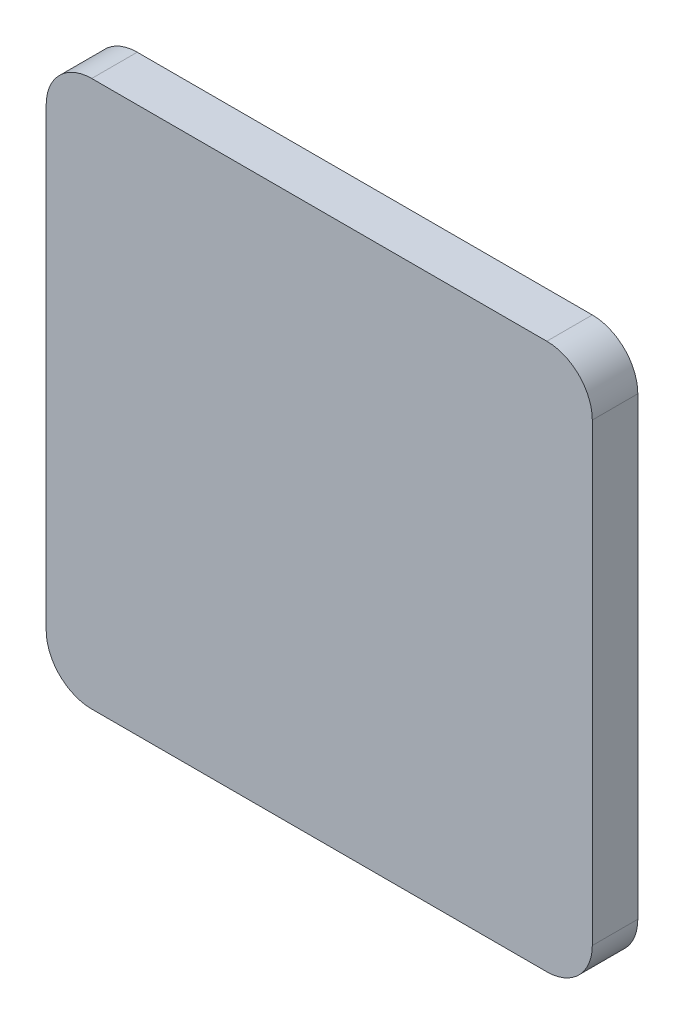
ISO-10303-21;
HEADER;
FILE_DESCRIPTION(('STEP AP214'),'2;1');
FILE_NAME('part.step','',(''),(''),'','','');
FILE_SCHEMA(('AUTOMOTIVE_DESIGN { 1 0 10303 214 1 1 1 1 }'));
ENDSEC;
DATA;
#1=APPLICATION_CONTEXT('core data for automotive mechanical design processes');
#2=APPLICATION_PROTOCOL_DEFINITION('international standard','automotive_design',2000,#1);
#3=PRODUCT_CONTEXT('',#1,'mechanical');
#4=PRODUCT('Part','Part','',(#3));
#5=PRODUCT_RELATED_PRODUCT_CATEGORY('part','',(#4));
#6=PRODUCT_DEFINITION_FORMATION('','',#4);
#7=PRODUCT_DEFINITION_CONTEXT('part definition',#1,'design');
#8=PRODUCT_DEFINITION('design','',#6,#7);
#9=PRODUCT_DEFINITION_SHAPE('','',#8);
#10=(LENGTH_UNIT() NAMED_UNIT(*) SI_UNIT(.MILLI.,.METRE.));
#11=(NAMED_UNIT(*) PLANE_ANGLE_UNIT() SI_UNIT($,.RADIAN.));
#12=(NAMED_UNIT(*) SI_UNIT($,.STERADIAN.) SOLID_ANGLE_UNIT());
#13=UNCERTAINTY_MEASURE_WITH_UNIT(LENGTH_MEASURE(1.E-05),#10,'distance_accuracy_value','');
#14=(GEOMETRIC_REPRESENTATION_CONTEXT(3) GLOBAL_UNCERTAINTY_ASSIGNED_CONTEXT((#13)) GLOBAL_UNIT_ASSIGNED_CONTEXT((#10,
#11,#12)) REPRESENTATION_CONTEXT('',''));
#15=CARTESIAN_POINT('',(0.,0.,0.));
#16=DIRECTION('',(0.,0.,1.));
#17=DIRECTION('',(1.,0.,0.));
#18=AXIS2_PLACEMENT_3D('',#15,#16,#17);
#19=CARTESIAN_POINT('',(-49.9999999999999,60.,10.));
#20=DIRECTION('',(0.,1.,0.));
#21=DIRECTION('',(0.,0.,1.));
#22=AXIS2_PLACEMENT_3D('',#19,#20,#21);
#23=PLANE('',#22);
#24=DIRECTION('',(1.,0.,0.));
#25=VECTOR('',#24,1.);
#26=CARTESIAN_POINT('',(-49.9999999999999,60.,0.));
#27=LINE('',#26,#25);
#28=CARTESIAN_POINT('',(-49.9999999999999,60.,0.));
#29=VERTEX_POINT('',#28);
#30=CARTESIAN_POINT('',(49.9999999999999,60.,0.));
#31=VERTEX_POINT('',#30);
#32=EDGE_CURVE('E130',#29,#31,#27,.T.);
#33=ORIENTED_EDGE('',*,*,#32,.F.);
#34=DIRECTION('',(0.,0.,-1.));
#35=VECTOR('',#34,1.);
#36=CARTESIAN_POINT('',(-49.9999999999999,60.,10.));
#37=LINE('',#36,#35);
#38=CARTESIAN_POINT('',(-49.9999999999999,60.,10.));
#39=VERTEX_POINT('',#38);
#40=EDGE_CURVE('E11',#39,#29,#37,.T.);
#41=ORIENTED_EDGE('',*,*,#40,.F.);
#42=DIRECTION('',(1.,0.,0.));
#43=VECTOR('',#42,1.);
#44=CARTESIAN_POINT('',(-49.9999999999999,60.,10.));
#45=LINE('',#44,#43);
#46=CARTESIAN_POINT('',(49.9999999999999,60.,10.));
#47=VERTEX_POINT('',#46);
#48=EDGE_CURVE('E147',#39,#47,#45,.T.);
#49=ORIENTED_EDGE('',*,*,#48,.T.);
#50=DIRECTION('',(0.,0.,-1.));
#51=VECTOR('',#50,1.);
#52=CARTESIAN_POINT('',(49.9999999999999,60.,10.));
#53=LINE('',#52,#51);
#54=EDGE_CURVE('E35',#47,#31,#53,.T.);
#55=ORIENTED_EDGE('',*,*,#54,.T.);
#56=EDGE_LOOP('',(#33,#41,#49,#55));
#57=FACE_BOUND('',#56,.T.);
#58=ADVANCED_FACE('F32',(#57),#23,.T.);
#59=CARTESIAN_POINT('',(-50.,50.,10.));
#60=DIRECTION('',(0.,0.,-1.));
#61=DIRECTION('',(-1.,0.,0.));
#62=AXIS2_PLACEMENT_3D('',#59,#60,#61);
#63=CYLINDRICAL_SURFACE('',#62,10.);
#64=CARTESIAN_POINT('',(-50.,50.,0.));
#65=DIRECTION('',(0.,0.,1.));
#66=DIRECTION('',(1.,0.,0.));
#67=AXIS2_PLACEMENT_3D('',#64,#65,#66);
#68=CIRCLE('',#67,10.);
#69=CARTESIAN_POINT('',(-60.,49.9999999999999,0.));
#70=VERTEX_POINT('',#69);
#71=EDGE_CURVE('E77',#29,#70,#68,.T.);
#72=ORIENTED_EDGE('',*,*,#71,.T.);
#73=DIRECTION('',(0.,0.,-1.));
#74=VECTOR('',#73,1.);
#75=CARTESIAN_POINT('',(-60.,49.9999999999999,10.));
#76=LINE('',#75,#74);
#77=CARTESIAN_POINT('',(-60.,49.9999999999999,10.));
#78=VERTEX_POINT('',#77);
#79=EDGE_CURVE('E41',#78,#70,#76,.T.);
#80=ORIENTED_EDGE('',*,*,#79,.F.);
#81=CARTESIAN_POINT('',(-50.,50.,10.));
#82=DIRECTION('',(0.,0.,1.));
#83=DIRECTION('',(1.,0.,0.));
#84=AXIS2_PLACEMENT_3D('',#81,#82,#83);
#85=CIRCLE('',#84,10.);
#86=EDGE_CURVE('E108',#39,#78,#85,.T.);
#87=ORIENTED_EDGE('',*,*,#86,.F.);
#88=ORIENTED_EDGE('',*,*,#40,.T.);
#89=EDGE_LOOP('',(#72,#80,#87,#88));
#90=FACE_BOUND('',#89,.T.);
#91=ADVANCED_FACE('F186',(#90),#63,.T.);
#92=CARTESIAN_POINT('',(-60.,49.9999999999999,10.));
#93=DIRECTION('',(1.,0.,0.));
#94=DIRECTION('',(0.,1.,0.));
#95=AXIS2_PLACEMENT_3D('',#92,#93,#94);
#96=PLANE('',#95);
#97=DIRECTION('',(0.,-1.,0.));
#98=VECTOR('',#97,1.);
#99=CARTESIAN_POINT('',(-60.,49.9999999999999,0.));
#100=LINE('',#99,#98);
#101=CARTESIAN_POINT('',(-60.,-49.9999999999999,0.));
#102=VERTEX_POINT('',#101);
#103=EDGE_CURVE('E115',#70,#102,#100,.T.);
#104=ORIENTED_EDGE('',*,*,#103,.T.);
#105=DIRECTION('',(0.,0.,-1.));
#106=VECTOR('',#105,1.);
#107=CARTESIAN_POINT('',(-60.,-49.9999999999999,10.));
#108=LINE('',#107,#106);
#109=CARTESIAN_POINT('',(-60.,-49.9999999999999,10.));
#110=VERTEX_POINT('',#109);
#111=EDGE_CURVE('E112',#110,#102,#108,.T.);
#112=ORIENTED_EDGE('',*,*,#111,.F.);
#113=DIRECTION('',(0.,-1.,0.));
#114=VECTOR('',#113,1.);
#115=CARTESIAN_POINT('',(-60.,49.9999999999999,10.));
#116=LINE('',#115,#114);
#117=EDGE_CURVE('E101',#78,#110,#116,.T.);
#118=ORIENTED_EDGE('',*,*,#117,.F.);
#119=ORIENTED_EDGE('',*,*,#79,.T.);
#120=EDGE_LOOP('',(#104,#112,#118,#119));
#121=FACE_BOUND('',#120,.T.);
#122=ADVANCED_FACE('F113',(#121),#96,.F.);
#123=CARTESIAN_POINT('',(-50.,-50.,10.));
#124=DIRECTION('',(0.,0.,-1.));
#125=DIRECTION('',(-1.,0.,0.));
#126=AXIS2_PLACEMENT_3D('',#123,#124,#125);
#127=CYLINDRICAL_SURFACE('',#126,10.);
#128=CARTESIAN_POINT('',(-50.,-50.,0.));
#129=DIRECTION('',(0.,0.,1.));
#130=DIRECTION('',(1.,0.,0.));
#131=AXIS2_PLACEMENT_3D('',#128,#129,#130);
#132=CIRCLE('',#131,10.);
#133=CARTESIAN_POINT('',(-49.9999999999999,-60.,0.));
#134=VERTEX_POINT('',#133);
#135=EDGE_CURVE('E144',#102,#134,#132,.T.);
#136=ORIENTED_EDGE('',*,*,#135,.T.);
#137=DIRECTION('',(0.,0.,-1.));
#138=VECTOR('',#137,1.);
#139=CARTESIAN_POINT('',(-49.9999999999999,-60.,10.));
#140=LINE('',#139,#138);
#141=CARTESIAN_POINT('',(-49.9999999999999,-60.,10.));
#142=VERTEX_POINT('',#141);
#143=EDGE_CURVE('E118',#142,#134,#140,.T.);
#144=ORIENTED_EDGE('',*,*,#143,.F.);
#145=CARTESIAN_POINT('',(-50.,-50.,10.));
#146=DIRECTION('',(0.,0.,1.));
#147=DIRECTION('',(1.,0.,0.));
#148=AXIS2_PLACEMENT_3D('',#145,#146,#147);
#149=CIRCLE('',#148,10.);
#150=EDGE_CURVE('E106',#110,#142,#149,.T.);
#151=ORIENTED_EDGE('',*,*,#150,.F.);
#152=ORIENTED_EDGE('',*,*,#111,.T.);
#153=EDGE_LOOP('',(#136,#144,#151,#152));
#154=FACE_BOUND('',#153,.T.);
#155=ADVANCED_FACE('F120',(#154),#127,.T.);
#156=CARTESIAN_POINT('',(-49.9999999999999,-60.,10.));
#157=DIRECTION('',(0.,1.,0.));
#158=DIRECTION('',(0.,0.,1.));
#159=AXIS2_PLACEMENT_3D('',#156,#157,#158);
#160=PLANE('',#159);
#161=DIRECTION('',(1.,0.,0.));
#162=VECTOR('',#161,1.);
#163=CARTESIAN_POINT('',(-49.9999999999999,-60.,0.));
#164=LINE('',#163,#162);
#165=CARTESIAN_POINT('',(49.9999999999999,-60.,0.));
#166=VERTEX_POINT('',#165);
#167=EDGE_CURVE('E142',#134,#166,#164,.T.);
#168=ORIENTED_EDGE('',*,*,#167,.T.);
#169=DIRECTION('',(0.,0.,-1.));
#170=VECTOR('',#169,1.);
#171=CARTESIAN_POINT('',(49.9999999999999,-60.,10.));
#172=LINE('',#171,#170);
#173=CARTESIAN_POINT('',(49.9999999999999,-60.,10.));
#174=VERTEX_POINT('',#173);
#175=EDGE_CURVE('E151',#174,#166,#172,.T.);
#176=ORIENTED_EDGE('',*,*,#175,.F.);
#177=DIRECTION('',(1.,0.,0.));
#178=VECTOR('',#177,1.);
#179=CARTESIAN_POINT('',(-49.9999999999999,-60.,10.));
#180=LINE('',#179,#178);
#181=EDGE_CURVE('E123',#142,#174,#180,.T.);
#182=ORIENTED_EDGE('',*,*,#181,.F.);
#183=ORIENTED_EDGE('',*,*,#143,.T.);
#184=EDGE_LOOP('',(#168,#176,#182,#183));
#185=FACE_BOUND('',#184,.T.);
#186=ADVANCED_FACE('F163',(#185),#160,.F.);
#187=CARTESIAN_POINT('',(50.,-50.,10.));
#188=DIRECTION('',(0.,0.,-1.));
#189=DIRECTION('',(-1.,0.,0.));
#190=AXIS2_PLACEMENT_3D('',#187,#188,#189);
#191=CYLINDRICAL_SURFACE('',#190,10.);
#192=CARTESIAN_POINT('',(50.,-50.,0.));
#193=DIRECTION('',(0.,0.,1.));
#194=DIRECTION('',(1.,0.,0.));
#195=AXIS2_PLACEMENT_3D('',#192,#193,#194);
#196=CIRCLE('',#195,10.);
#197=CARTESIAN_POINT('',(60.,-50.,0.));
#198=VERTEX_POINT('',#197);
#199=EDGE_CURVE('E139',#166,#198,#196,.T.);
#200=ORIENTED_EDGE('',*,*,#199,.T.);
#201=DIRECTION('',(0.,0.,-1.));
#202=VECTOR('',#201,1.);
#203=CARTESIAN_POINT('',(60.,-50.,10.));
#204=LINE('',#203,#202);
#205=CARTESIAN_POINT('',(60.,-50.,10.));
#206=VERTEX_POINT('',#205);
#207=EDGE_CURVE('E154',#206,#198,#204,.T.);
#208=ORIENTED_EDGE('',*,*,#207,.F.);
#209=CARTESIAN_POINT('',(50.,-50.,10.));
#210=DIRECTION('',(0.,0.,1.));
#211=DIRECTION('',(1.,0.,0.));
#212=AXIS2_PLACEMENT_3D('',#209,#210,#211);
#213=CIRCLE('',#212,10.);
#214=EDGE_CURVE('E125',#174,#206,#213,.T.);
#215=ORIENTED_EDGE('',*,*,#214,.F.);
#216=ORIENTED_EDGE('',*,*,#175,.T.);
#217=EDGE_LOOP('',(#200,#208,#215,#216));
#218=FACE_BOUND('',#217,.T.);
#219=ADVANCED_FACE('F171',(#218),#191,.T.);
#220=CARTESIAN_POINT('',(60.,49.9999999999999,10.));
#221=DIRECTION('',(1.,0.,0.));
#222=DIRECTION('',(0.,1.,0.));
#223=AXIS2_PLACEMENT_3D('',#220,#221,#222);
#224=PLANE('',#223);
#225=DIRECTION('',(0.,-1.,0.));
#226=VECTOR('',#225,1.);
#227=CARTESIAN_POINT('',(60.,49.9999999999999,0.));
#228=LINE('',#227,#226);
#229=CARTESIAN_POINT('',(60.,49.9999999999999,0.));
#230=VERTEX_POINT('',#229);
#231=EDGE_CURVE('E136',#230,#198,#228,.T.);
#232=ORIENTED_EDGE('',*,*,#231,.F.);
#233=DIRECTION('',(0.,0.,-1.));
#234=VECTOR('',#233,1.);
#235=CARTESIAN_POINT('',(60.,49.9999999999999,10.));
#236=LINE('',#235,#234);
#237=CARTESIAN_POINT('',(60.,49.9999999999999,10.));
#238=VERTEX_POINT('',#237);
#239=EDGE_CURVE('E155',#238,#230,#236,.T.);
#240=ORIENTED_EDGE('',*,*,#239,.F.);
#241=DIRECTION('',(0.,-1.,0.));
#242=VECTOR('',#241,1.);
#243=CARTESIAN_POINT('',(60.,49.9999999999999,10.));
#244=LINE('',#243,#242);
#245=EDGE_CURVE('E169',#238,#206,#244,.T.);
#246=ORIENTED_EDGE('',*,*,#245,.T.);
#247=ORIENTED_EDGE('',*,*,#207,.T.);
#248=EDGE_LOOP('',(#232,#240,#246,#247));
#249=FACE_BOUND('',#248,.T.);
#250=ADVANCED_FACE('F173',(#249),#224,.T.);
#251=CARTESIAN_POINT('',(50.,50.,10.));
#252=DIRECTION('',(0.,0.,-1.));
#253=DIRECTION('',(-1.,0.,0.));
#254=AXIS2_PLACEMENT_3D('',#251,#252,#253);
#255=CYLINDRICAL_SURFACE('',#254,10.);
#256=CARTESIAN_POINT('',(50.,50.,0.));
#257=DIRECTION('',(0.,0.,-1.));
#258=DIRECTION('',(-1.,0.,0.));
#259=AXIS2_PLACEMENT_3D('',#256,#257,#258);
#260=CIRCLE('',#259,10.);
#261=EDGE_CURVE('E133',#31,#230,#260,.T.);
#262=ORIENTED_EDGE('',*,*,#261,.F.);
#263=ORIENTED_EDGE('',*,*,#54,.F.);
#264=CARTESIAN_POINT('',(50.,50.,10.));
#265=DIRECTION('',(0.,0.,-1.));
#266=DIRECTION('',(-1.,0.,0.));
#267=AXIS2_PLACEMENT_3D('',#264,#265,#266);
#268=CIRCLE('',#267,10.);
#269=EDGE_CURVE('E174',#47,#238,#268,.T.);
#270=ORIENTED_EDGE('',*,*,#269,.T.);
#271=ORIENTED_EDGE('',*,*,#239,.T.);
#272=EDGE_LOOP('',(#262,#263,#270,#271));
#273=FACE_BOUND('',#272,.T.);
#274=ADVANCED_FACE('F157',(#273),#255,.T.);
#275=CARTESIAN_POINT('',(50.,50.,10.));
#276=DIRECTION('',(0.,0.,-1.));
#277=DIRECTION('',(-1.,0.,0.));
#278=AXIS2_PLACEMENT_3D('',#275,#276,#277);
#279=PLANE('',#278);
#280=ORIENTED_EDGE('',*,*,#48,.F.);
#281=ORIENTED_EDGE('',*,*,#86,.T.);
#282=ORIENTED_EDGE('',*,*,#117,.T.);
#283=ORIENTED_EDGE('',*,*,#150,.T.);
#284=ORIENTED_EDGE('',*,*,#181,.T.);
#285=ORIENTED_EDGE('',*,*,#214,.T.);
#286=ORIENTED_EDGE('',*,*,#245,.F.);
#287=ORIENTED_EDGE('',*,*,#269,.F.);
#288=EDGE_LOOP('',(#280,#281,#282,#283,#284,#285,#286,#287));
#289=FACE_BOUND('',#288,.T.);
#290=ADVANCED_FACE('F104',(#289),#279,.F.);
#291=CARTESIAN_POINT('',(50.,50.,0.));
#292=DIRECTION('',(0.,0.,-1.));
#293=DIRECTION('',(-1.,0.,0.));
#294=AXIS2_PLACEMENT_3D('',#291,#292,#293);
#295=PLANE('',#294);
#296=ORIENTED_EDGE('',*,*,#32,.T.);
#297=ORIENTED_EDGE('',*,*,#261,.T.);
#298=ORIENTED_EDGE('',*,*,#231,.T.);
#299=ORIENTED_EDGE('',*,*,#199,.F.);
#300=ORIENTED_EDGE('',*,*,#167,.F.);
#301=ORIENTED_EDGE('',*,*,#135,.F.);
#302=ORIENTED_EDGE('',*,*,#103,.F.);
#303=ORIENTED_EDGE('',*,*,#71,.F.);
#304=EDGE_LOOP('',(#296,#297,#298,#299,#300,#301,#302,#303));
#305=FACE_BOUND('',#304,.T.);
#306=ADVANCED_FACE('F159',(#305),#295,.T.);
#307=CLOSED_SHELL('',(#58,#91,#122,#155,#186,#219,#250,#274,#290,#306));
#308=MANIFOLD_SOLID_BREP('B2',#307);
#309=ADVANCED_BREP_SHAPE_REPRESENTATION('',(#18,#308),#14);
#310=SHAPE_DEFINITION_REPRESENTATION(#9,#309);
ENDSEC;
END-ISO-10303-21;
